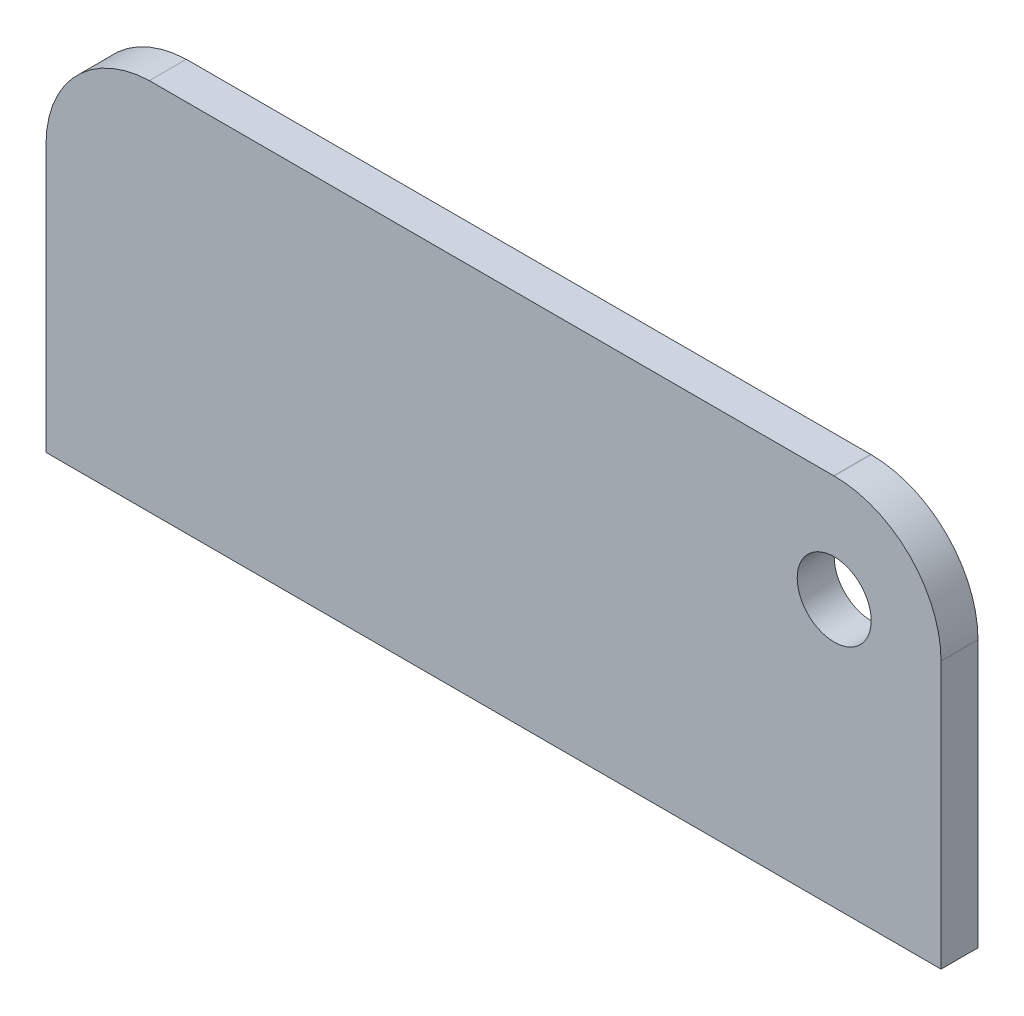
ISO-10303-21;
HEADER;
FILE_DESCRIPTION(('STEP AP214'),'2;1');
FILE_NAME('part.step','',(''),(''),'','','');
FILE_SCHEMA(('AUTOMOTIVE_DESIGN { 1 0 10303 214 1 1 1 1 }'));
ENDSEC;
DATA;
#1=APPLICATION_CONTEXT('core data for automotive mechanical design processes');
#2=APPLICATION_PROTOCOL_DEFINITION('international standard','automotive_design',2000,#1);
#3=PRODUCT_CONTEXT('',#1,'mechanical');
#4=PRODUCT('Part','Part','',(#3));
#5=PRODUCT_RELATED_PRODUCT_CATEGORY('part','',(#4));
#6=PRODUCT_DEFINITION_FORMATION('','',#4);
#7=PRODUCT_DEFINITION_CONTEXT('part definition',#1,'design');
#8=PRODUCT_DEFINITION('design','',#6,#7);
#9=PRODUCT_DEFINITION_SHAPE('','',#8);
#10=(LENGTH_UNIT() NAMED_UNIT(*) SI_UNIT(.MILLI.,.METRE.));
#11=(NAMED_UNIT(*) PLANE_ANGLE_UNIT() SI_UNIT($,.RADIAN.));
#12=(NAMED_UNIT(*) SI_UNIT($,.STERADIAN.) SOLID_ANGLE_UNIT());
#13=UNCERTAINTY_MEASURE_WITH_UNIT(LENGTH_MEASURE(1.E-05),#10,'distance_accuracy_value','');
#14=(GEOMETRIC_REPRESENTATION_CONTEXT(3) GLOBAL_UNCERTAINTY_ASSIGNED_CONTEXT((#13)) GLOBAL_UNIT_ASSIGNED_CONTEXT((#10,
#11,#12)) REPRESENTATION_CONTEXT('',''));
#15=CARTESIAN_POINT('',(0.,0.,0.));
#16=DIRECTION('',(0.,0.,1.));
#17=DIRECTION('',(1.,0.,0.));
#18=AXIS2_PLACEMENT_3D('',#15,#16,#17);
#19=CARTESIAN_POINT('',(0.,0.,0.));
#20=DIRECTION('',(0.,0.,1.));
#21=DIRECTION('',(1.,0.,0.));
#22=AXIS2_PLACEMENT_3D('',#19,#20,#21);
#23=PLANE('',#22);
#24=CARTESIAN_POINT('',(41.266,8.006,0.));
#25=DIRECTION('',(0.,0.,-1.));
#26=DIRECTION('',(-1.,0.,0.));
#27=AXIS2_PLACEMENT_3D('',#24,#25,#26);
#28=CIRCLE('',#27,3.175);
#29=CARTESIAN_POINT('',(38.091,8.006,0.));
#30=VERTEX_POINT('',#29);
#31=EDGE_CURVE('E206',#30,#30,#28,.T.);
#32=ORIENTED_EDGE('',*,*,#31,.F.);
#33=EDGE_LOOP('',(#32));
#34=FACE_BOUND('',#33,.T.);
#35=CARTESIAN_POINT('',(-17.236,8.006,0.));
#36=DIRECTION('',(0.,0.,-1.));
#37=DIRECTION('',(-1.,0.,0.));
#38=AXIS2_PLACEMENT_3D('',#35,#36,#37);
#39=CIRCLE('',#38,9.18);
#40=CARTESIAN_POINT('',(-26.416,8.006,0.));
#41=VERTEX_POINT('',#40);
#42=CARTESIAN_POINT('',(-17.538943889194,17.181,0.));
#43=VERTEX_POINT('',#42);
#44=EDGE_CURVE('E61',#41,#43,#39,.T.);
#45=ORIENTED_EDGE('',*,*,#44,.T.);
#46=DIRECTION('',(-1.,0.,0.));
#47=VECTOR('',#46,1.);
#48=CARTESIAN_POINT('',(0.,17.181,0.));
#49=LINE('',#48,#47);
#50=CARTESIAN_POINT('',(41.2211691943853,17.1808904730757,0.));
#51=VERTEX_POINT('',#50);
#52=EDGE_CURVE('E116',#51,#43,#49,.T.);
#53=ORIENTED_EDGE('',*,*,#52,.F.);
#54=CARTESIAN_POINT('',(41.4581649357941,-70.6495997346095,0.));
#55=DIRECTION('',(0.,0.,-1.));
#56=DIRECTION('',(-1.,0.,0.));
#57=AXIS2_PLACEMENT_3D('',#54,#55,#56);
#58=CIRCLE('',#57,87.8308099535905);
#59=CARTESIAN_POINT('',(41.2660000000036,17.181,0.));
#60=VERTEX_POINT('',#59);
#61=EDGE_CURVE('E170',#60,#51,#58,.F.);
#62=ORIENTED_EDGE('',*,*,#61,.F.);
#63=CARTESIAN_POINT('',(41.266,8.006,0.));
#64=DIRECTION('',(0.,0.,-1.));
#65=DIRECTION('',(-1.,0.,0.));
#66=AXIS2_PLACEMENT_3D('',#63,#64,#65);
#67=CIRCLE('',#66,9.175);
#68=CARTESIAN_POINT('',(50.441,8.006,0.));
#69=VERTEX_POINT('',#68);
#70=EDGE_CURVE('E234',#60,#69,#67,.T.);
#71=ORIENTED_EDGE('',*,*,#70,.T.);
#72=DIRECTION('',(0.,-1.,0.));
#73=VECTOR('',#72,1.);
#74=CARTESIAN_POINT('',(50.441,0.,0.));
#75=LINE('',#74,#73);
#76=CARTESIAN_POINT('',(50.441,-14.906,0.));
#77=VERTEX_POINT('',#76);
#78=EDGE_CURVE('E139',#69,#77,#75,.T.);
#79=ORIENTED_EDGE('',*,*,#78,.T.);
#80=DIRECTION('',(-1.,0.,0.));
#81=VECTOR('',#80,1.);
#82=CARTESIAN_POINT('',(26.416,-14.906,0.));
#83=LINE('',#82,#81);
#84=CARTESIAN_POINT('',(-26.416,-14.906,0.));
#85=VERTEX_POINT('',#84);
#86=EDGE_CURVE('E214',#77,#85,#83,.T.);
#87=ORIENTED_EDGE('',*,*,#86,.T.);
#88=DIRECTION('',(0.,1.,0.));
#89=VECTOR('',#88,1.);
#90=CARTESIAN_POINT('',(-26.416,0.,0.));
#91=LINE('',#90,#89);
#92=EDGE_CURVE('E118',#85,#41,#91,.T.);
#93=ORIENTED_EDGE('',*,*,#92,.T.);
#94=EDGE_LOOP('',(#45,#53,#62,#71,#79,#87,#93));
#95=FACE_BOUND('',#94,.T.);
#96=ADVANCED_FACE('F45',(#34,#95),#23,.F.);
#97=CARTESIAN_POINT('',(0.,0.,3.175));
#98=DIRECTION('',(0.,0.,1.));
#99=DIRECTION('',(1.,0.,0.));
#100=AXIS2_PLACEMENT_3D('',#97,#98,#99);
#101=PLANE('',#100);
#102=CARTESIAN_POINT('',(41.266,8.006,3.175));
#103=DIRECTION('',(0.,0.,1.));
#104=DIRECTION('',(1.,0.,0.));
#105=AXIS2_PLACEMENT_3D('',#102,#103,#104);
#106=CIRCLE('',#105,3.175);
#107=CARTESIAN_POINT('',(44.441,8.006,3.175));
#108=VERTEX_POINT('',#107);
#109=EDGE_CURVE('E209',#108,#108,#106,.T.);
#110=ORIENTED_EDGE('',*,*,#109,.F.);
#111=EDGE_LOOP('',(#110));
#112=FACE_BOUND('',#111,.T.);
#113=DIRECTION('',(-1.,0.,0.));
#114=VECTOR('',#113,1.);
#115=CARTESIAN_POINT('',(0.,17.181,3.175));
#116=LINE('',#115,#114);
#117=CARTESIAN_POINT('',(41.2211691948831,17.1809176704177,3.175));
#118=VERTEX_POINT('',#117);
#119=CARTESIAN_POINT('',(-17.538943889194,17.181,3.175));
#120=VERTEX_POINT('',#119);
#121=EDGE_CURVE('E136',#118,#120,#116,.T.);
#122=ORIENTED_EDGE('',*,*,#121,.T.);
#123=CARTESIAN_POINT('',(-17.236,8.006,3.175));
#124=DIRECTION('',(0.,0.,1.));
#125=DIRECTION('',(1.,0.,0.));
#126=AXIS2_PLACEMENT_3D('',#123,#124,#125);
#127=CIRCLE('',#126,9.18);
#128=CARTESIAN_POINT('',(-26.416,8.006,3.175));
#129=VERTEX_POINT('',#128);
#130=EDGE_CURVE('E107',#120,#129,#127,.T.);
#131=ORIENTED_EDGE('',*,*,#130,.T.);
#132=DIRECTION('',(0.,1.,0.));
#133=VECTOR('',#132,1.);
#134=CARTESIAN_POINT('',(-26.416,0.,3.175));
#135=LINE('',#134,#133);
#136=CARTESIAN_POINT('',(-26.416,-14.906,3.175));
#137=VERTEX_POINT('',#136);
#138=EDGE_CURVE('E126',#137,#129,#135,.T.);
#139=ORIENTED_EDGE('',*,*,#138,.F.);
#140=DIRECTION('',(-1.,0.,0.));
#141=VECTOR('',#140,1.);
#142=CARTESIAN_POINT('',(26.416,-14.906,3.175));
#143=LINE('',#142,#141);
#144=CARTESIAN_POINT('',(50.441,-14.906,3.175));
#145=VERTEX_POINT('',#144);
#146=EDGE_CURVE('E217',#145,#137,#143,.T.);
#147=ORIENTED_EDGE('',*,*,#146,.F.);
#148=DIRECTION('',(0.,1.,0.));
#149=VECTOR('',#148,1.);
#150=CARTESIAN_POINT('',(50.441,0.,3.175));
#151=LINE('',#150,#149);
#152=CARTESIAN_POINT('',(50.441,8.006,3.175));
#153=VERTEX_POINT('',#152);
#154=EDGE_CURVE('E154',#145,#153,#151,.T.);
#155=ORIENTED_EDGE('',*,*,#154,.T.);
#156=CARTESIAN_POINT('',(41.266,8.006,3.175));
#157=DIRECTION('',(0.,0.,1.));
#158=DIRECTION('',(1.,0.,0.));
#159=AXIS2_PLACEMENT_3D('',#156,#157,#158);
#160=CIRCLE('',#159,9.175);
#161=CARTESIAN_POINT('',(41.2660000000036,17.181,3.175));
#162=VERTEX_POINT('',#161);
#163=EDGE_CURVE('E163',#162,#153,#160,.F.);
#164=ORIENTED_EDGE('',*,*,#163,.F.);
#165=CARTESIAN_POINT('',(41.4581649357941,-70.6495997346095,3.175));
#166=DIRECTION('',(0.,0.,1.));
#167=DIRECTION('',(1.,0.,0.));
#168=AXIS2_PLACEMENT_3D('',#165,#166,#167);
#169=CIRCLE('',#168,87.8308099535905);
#170=EDGE_CURVE('E160',#162,#118,#169,.T.);
#171=ORIENTED_EDGE('',*,*,#170,.T.);
#172=EDGE_LOOP('',(#122,#131,#139,#147,#155,#164,#171));
#173=FACE_BOUND('',#172,.T.);
#174=ADVANCED_FACE('F196',(#112,#173),#101,.T.);
#175=CARTESIAN_POINT('',(0.,17.181,78.0377971843986));
#176=DIRECTION('',(0.,-1.,0.));
#177=DIRECTION('',(0.,0.,-1.));
#178=AXIS2_PLACEMENT_3D('',#175,#176,#177);
#179=PLANE('',#178);
#180=DIRECTION('',(0.,0.,-1.));
#181=VECTOR('',#180,1.);
#182=CARTESIAN_POINT('',(-17.538943889194,17.181,10.));
#183=LINE('',#182,#181);
#184=EDGE_CURVE('E104',#120,#43,#183,.T.);
#185=ORIENTED_EDGE('',*,*,#184,.F.);
#186=ORIENTED_EDGE('',*,*,#121,.F.);
#187=CARTESIAN_POINT('',(41.2211690466159,17.181,3.175));
#188=DIRECTION('',(0.,0.,-1.));
#189=VECTOR('',#188,1.);
#190=LINE('',#187,#189);
#191=EDGE_CURVE('E123',#118,#51,#190,.T.);
#192=ORIENTED_EDGE('',*,*,#191,.T.);
#193=ORIENTED_EDGE('',*,*,#52,.T.);
#194=EDGE_LOOP('',(#185,#186,#192,#193));
#195=FACE_BOUND('',#194,.T.);
#196=ADVANCED_FACE('F121',(#195),#179,.F.);
#197=CARTESIAN_POINT('',(-26.416,0.,78.0377971843986));
#198=DIRECTION('',(-1.,0.,0.));
#199=DIRECTION('',(0.,0.,1.));
#200=AXIS2_PLACEMENT_3D('',#197,#198,#199);
#201=PLANE('',#200);
#202=ORIENTED_EDGE('',*,*,#138,.T.);
#203=DIRECTION('',(0.,0.,-1.));
#204=VECTOR('',#203,1.);
#205=CARTESIAN_POINT('',(-26.416,8.006,10.));
#206=LINE('',#205,#204);
#207=EDGE_CURVE('E11',#129,#41,#206,.T.);
#208=ORIENTED_EDGE('',*,*,#207,.T.);
#209=ORIENTED_EDGE('',*,*,#92,.F.);
#210=DIRECTION('',(0.,0.,-1.));
#211=VECTOR('',#210,1.);
#212=CARTESIAN_POINT('',(-26.416,-14.906,3.175));
#213=LINE('',#212,#211);
#214=EDGE_CURVE('E54',#137,#85,#213,.T.);
#215=ORIENTED_EDGE('',*,*,#214,.F.);
#216=EDGE_LOOP('',(#202,#208,#209,#215));
#217=FACE_BOUND('',#216,.T.);
#218=ADVANCED_FACE('F186',(#217),#201,.T.);
#219=CARTESIAN_POINT('',(41.4581649357941,-70.6495997346095,86.4610973872591));
#220=DIRECTION('',(0.,0.,-1.));
#221=DIRECTION('',(-1.,0.,0.));
#222=AXIS2_PLACEMENT_3D('',#219,#220,#221);
#223=CYLINDRICAL_SURFACE('',#222,87.8308099535905);
#224=ORIENTED_EDGE('',*,*,#191,.F.);
#225=ORIENTED_EDGE('',*,*,#170,.F.);
#226=DIRECTION('',(0.,0.,-1.));
#227=VECTOR('',#226,1.);
#228=CARTESIAN_POINT('',(41.2660000000036,17.181,86.4610973872591));
#229=LINE('',#228,#227);
#230=EDGE_CURVE('E68',#162,#60,#229,.T.);
#231=ORIENTED_EDGE('',*,*,#230,.T.);
#232=ORIENTED_EDGE('',*,*,#61,.T.);
#233=EDGE_LOOP('',(#224,#225,#231,#232));
#234=FACE_BOUND('',#233,.T.);
#235=ADVANCED_FACE('F176',(#234),#223,.T.);
#236=CARTESIAN_POINT('',(26.416,-14.906,3.175));
#237=DIRECTION('',(0.,-1.,0.));
#238=DIRECTION('',(1.,0.,0.));
#239=AXIS2_PLACEMENT_3D('',#236,#237,#238);
#240=PLANE('',#239);
#241=ORIENTED_EDGE('',*,*,#86,.F.);
#242=DIRECTION('',(0.,0.,-1.));
#243=VECTOR('',#242,1.);
#244=CARTESIAN_POINT('',(50.441,-14.906,10.));
#245=LINE('',#244,#243);
#246=EDGE_CURVE('E149',#145,#77,#245,.T.);
#247=ORIENTED_EDGE('',*,*,#246,.F.);
#248=ORIENTED_EDGE('',*,*,#146,.T.);
#249=ORIENTED_EDGE('',*,*,#214,.T.);
#250=EDGE_LOOP('',(#241,#247,#248,#249));
#251=FACE_BOUND('',#250,.T.);
#252=ADVANCED_FACE('F47',(#251),#240,.T.);
#253=CARTESIAN_POINT('',(41.266,8.006,10.));
#254=DIRECTION('',(0.,0.,-1.));
#255=DIRECTION('',(-1.,0.,0.));
#256=AXIS2_PLACEMENT_3D('',#253,#254,#255);
#257=CYLINDRICAL_SURFACE('',#256,3.175);
#258=ORIENTED_EDGE('',*,*,#109,.T.);
#259=EDGE_LOOP('',(#258));
#260=FACE_BOUND('',#259,.T.);
#261=ORIENTED_EDGE('',*,*,#31,.T.);
#262=EDGE_LOOP('',(#261));
#263=FACE_BOUND('',#262,.T.);
#264=ADVANCED_FACE('F191',(#260,#263),#257,.F.);
#265=CARTESIAN_POINT('',(41.266,8.006,86.4610973872591));
#266=DIRECTION('',(0.,0.,-1.));
#267=DIRECTION('',(-1.,0.,0.));
#268=AXIS2_PLACEMENT_3D('',#265,#266,#267);
#269=CYLINDRICAL_SURFACE('',#268,9.175);
#270=ORIENTED_EDGE('',*,*,#163,.T.);
#271=DIRECTION('',(0.,0.,-1.));
#272=VECTOR('',#271,1.);
#273=CARTESIAN_POINT('',(50.441,8.006,10.));
#274=LINE('',#273,#272);
#275=EDGE_CURVE('E150',#153,#69,#274,.T.);
#276=ORIENTED_EDGE('',*,*,#275,.T.);
#277=ORIENTED_EDGE('',*,*,#70,.F.);
#278=ORIENTED_EDGE('',*,*,#230,.F.);
#279=EDGE_LOOP('',(#270,#276,#277,#278));
#280=FACE_BOUND('',#279,.T.);
#281=ADVANCED_FACE('F188',(#280),#269,.T.);
#282=CARTESIAN_POINT('',(50.441,0.,10.));
#283=DIRECTION('',(1.,0.,0.));
#284=DIRECTION('',(0.,0.,-1.));
#285=AXIS2_PLACEMENT_3D('',#282,#283,#284);
#286=PLANE('',#285);
#287=ORIENTED_EDGE('',*,*,#246,.T.);
#288=ORIENTED_EDGE('',*,*,#78,.F.);
#289=ORIENTED_EDGE('',*,*,#275,.F.);
#290=ORIENTED_EDGE('',*,*,#154,.F.);
#291=EDGE_LOOP('',(#287,#288,#289,#290));
#292=FACE_BOUND('',#291,.T.);
#293=ADVANCED_FACE('F187',(#292),#286,.T.);
#294=CARTESIAN_POINT('',(-17.236,8.006,10.));
#295=DIRECTION('',(0.,0.,-1.));
#296=DIRECTION('',(-1.,0.,0.));
#297=AXIS2_PLACEMENT_3D('',#294,#295,#296);
#298=CYLINDRICAL_SURFACE('',#297,9.18);
#299=ORIENTED_EDGE('',*,*,#184,.T.);
#300=ORIENTED_EDGE('',*,*,#44,.F.);
#301=ORIENTED_EDGE('',*,*,#207,.F.);
#302=ORIENTED_EDGE('',*,*,#130,.F.);
#303=EDGE_LOOP('',(#299,#300,#301,#302));
#304=FACE_BOUND('',#303,.T.);
#305=ADVANCED_FACE('F105',(#304),#298,.T.);
#306=CLOSED_SHELL('',(#96,#174,#196,#218,#235,#252,#264,#281,#293,#305));
#307=MANIFOLD_SOLID_BREP('B2',#306);
#308=ADVANCED_BREP_SHAPE_REPRESENTATION('',(#18,#307),#14);
#309=SHAPE_DEFINITION_REPRESENTATION(#9,#308);
ENDSEC;
END-ISO-10303-21;
